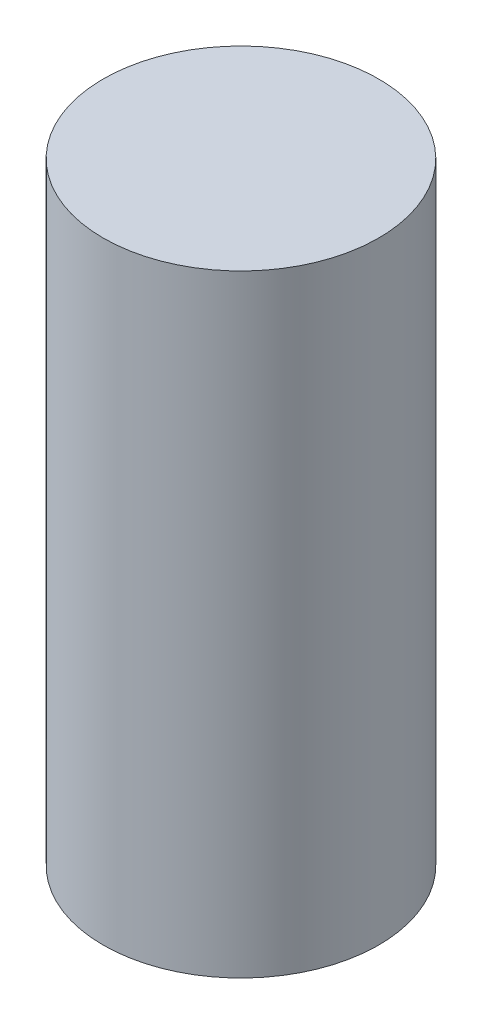
ISO-10303-21;
HEADER;
FILE_DESCRIPTION(('STEP AP214'),'2;1');
FILE_NAME('part.step','',(''),(''),'','','');
FILE_SCHEMA(('AUTOMOTIVE_DESIGN { 1 0 10303 214 1 1 1 1 }'));
ENDSEC;
DATA;
#1=APPLICATION_CONTEXT('core data for automotive mechanical design processes');
#2=APPLICATION_PROTOCOL_DEFINITION('international standard','automotive_design',2000,#1);
#3=PRODUCT_CONTEXT('',#1,'mechanical');
#4=PRODUCT('Part','Part','',(#3));
#5=PRODUCT_RELATED_PRODUCT_CATEGORY('part','',(#4));
#6=PRODUCT_DEFINITION_FORMATION('','',#4);
#7=PRODUCT_DEFINITION_CONTEXT('part definition',#1,'design');
#8=PRODUCT_DEFINITION('design','',#6,#7);
#9=PRODUCT_DEFINITION_SHAPE('','',#8);
#10=(LENGTH_UNIT() NAMED_UNIT(*) SI_UNIT(.MILLI.,.METRE.));
#11=(NAMED_UNIT(*) PLANE_ANGLE_UNIT() SI_UNIT($,.RADIAN.));
#12=(NAMED_UNIT(*) SI_UNIT($,.STERADIAN.) SOLID_ANGLE_UNIT());
#13=UNCERTAINTY_MEASURE_WITH_UNIT(LENGTH_MEASURE(1.E-05),#10,'distance_accuracy_value','');
#14=(GEOMETRIC_REPRESENTATION_CONTEXT(3) GLOBAL_UNCERTAINTY_ASSIGNED_CONTEXT((#13)) GLOBAL_UNIT_ASSIGNED_CONTEXT((#10,
#11,#12)) REPRESENTATION_CONTEXT('',''));
#15=CARTESIAN_POINT('',(0.,0.,0.));
#16=DIRECTION('',(0.,0.,1.));
#17=DIRECTION('',(1.,0.,0.));
#18=AXIS2_PLACEMENT_3D('',#15,#16,#17);
#19=CARTESIAN_POINT('',(0.,40.,0.));
#20=DIRECTION('',(0.,-1.,0.));
#21=DIRECTION('',(0.,0.,-1.));
#22=AXIS2_PLACEMENT_3D('',#19,#20,#21);
#23=CYLINDRICAL_SURFACE('',#22,9.);
#24=CARTESIAN_POINT('',(0.,40.,0.));
#25=DIRECTION('',(0.,1.,0.));
#26=DIRECTION('',(0.,0.,1.));
#27=AXIS2_PLACEMENT_3D('',#24,#25,#26);
#28=CIRCLE('',#27,9.);
#29=CARTESIAN_POINT('',(0.,40.,9.));
#30=VERTEX_POINT('',#29);
#31=EDGE_CURVE('E10',#30,#30,#28,.T.);
#32=ORIENTED_EDGE('',*,*,#31,.F.);
#33=EDGE_LOOP('',(#32));
#34=FACE_BOUND('',#33,.T.);
#35=CARTESIAN_POINT('',(0.,0.,0.));
#36=DIRECTION('',(0.,1.,0.));
#37=DIRECTION('',(0.,0.,1.));
#38=AXIS2_PLACEMENT_3D('',#35,#36,#37);
#39=CIRCLE('',#38,9.);
#40=CARTESIAN_POINT('',(0.,0.,9.));
#41=VERTEX_POINT('',#40);
#42=EDGE_CURVE('E33',#41,#41,#39,.T.);
#43=ORIENTED_EDGE('',*,*,#42,.T.);
#44=EDGE_LOOP('',(#43));
#45=FACE_BOUND('',#44,.T.);
#46=ADVANCED_FACE('F30',(#34,#45),#23,.T.);
#47=CARTESIAN_POINT('',(0.,40.,0.));
#48=DIRECTION('',(0.,1.,0.));
#49=DIRECTION('',(0.,0.,1.));
#50=AXIS2_PLACEMENT_3D('',#47,#48,#49);
#51=PLANE('',#50);
#52=ORIENTED_EDGE('',*,*,#31,.T.);
#53=EDGE_LOOP('',(#52));
#54=FACE_BOUND('',#53,.T.);
#55=ADVANCED_FACE('F45',(#54),#51,.T.);
#56=CARTESIAN_POINT('',(0.,0.,0.));
#57=DIRECTION('',(0.,1.,0.));
#58=DIRECTION('',(0.,0.,1.));
#59=AXIS2_PLACEMENT_3D('',#56,#57,#58);
#60=PLANE('',#59);
#61=ORIENTED_EDGE('',*,*,#42,.F.);
#62=EDGE_LOOP('',(#61));
#63=FACE_BOUND('',#62,.T.);
#64=ADVANCED_FACE('F43',(#63),#60,.F.);
#65=CLOSED_SHELL('',(#46,#55,#64));
#66=MANIFOLD_SOLID_BREP('B2',#65);
#67=ADVANCED_BREP_SHAPE_REPRESENTATION('',(#18,#66),#14);
#68=SHAPE_DEFINITION_REPRESENTATION(#9,#67);
ENDSEC;
END-ISO-10303-21;
